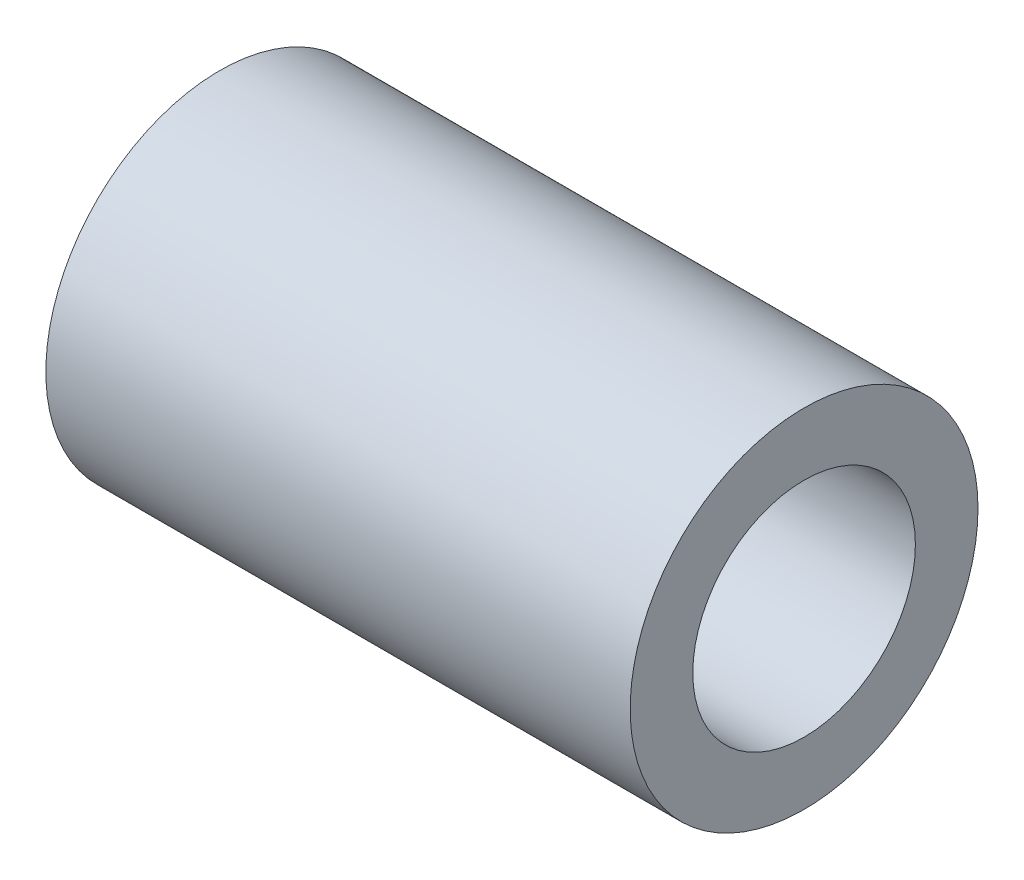
ISO-10303-21;
HEADER;
FILE_DESCRIPTION(('STEP AP214'),'2;1');
FILE_NAME('part.step','',(''),(''),'','','');
FILE_SCHEMA(('AUTOMOTIVE_DESIGN { 1 0 10303 214 1 1 1 1 }'));
ENDSEC;
DATA;
#1=APPLICATION_CONTEXT('core data for automotive mechanical design processes');
#2=APPLICATION_PROTOCOL_DEFINITION('international standard','automotive_design',2000,#1);
#3=PRODUCT_CONTEXT('',#1,'mechanical');
#4=PRODUCT('Part','Part','',(#3));
#5=PRODUCT_RELATED_PRODUCT_CATEGORY('part','',(#4));
#6=PRODUCT_DEFINITION_FORMATION('','',#4);
#7=PRODUCT_DEFINITION_CONTEXT('part definition',#1,'design');
#8=PRODUCT_DEFINITION('design','',#6,#7);
#9=PRODUCT_DEFINITION_SHAPE('','',#8);
#10=(LENGTH_UNIT() NAMED_UNIT(*) SI_UNIT(.MILLI.,.METRE.));
#11=(NAMED_UNIT(*) PLANE_ANGLE_UNIT() SI_UNIT($,.RADIAN.));
#12=(NAMED_UNIT(*) SI_UNIT($,.STERADIAN.) SOLID_ANGLE_UNIT());
#13=UNCERTAINTY_MEASURE_WITH_UNIT(LENGTH_MEASURE(1.E-05),#10,'distance_accuracy_value','');
#14=(GEOMETRIC_REPRESENTATION_CONTEXT(3) GLOBAL_UNCERTAINTY_ASSIGNED_CONTEXT((#13)) GLOBAL_UNIT_ASSIGNED_CONTEXT((#10,
#11,#12)) REPRESENTATION_CONTEXT('',''));
#15=CARTESIAN_POINT('',(0.,0.,0.));
#16=DIRECTION('',(0.,0.,1.));
#17=DIRECTION('',(1.,0.,0.));
#18=AXIS2_PLACEMENT_3D('',#15,#16,#17);
#19=CARTESIAN_POINT('',(8.4,0.,0.));
#20=DIRECTION('',(1.,0.,0.));
#21=DIRECTION('',(0.,0.,-1.));
#22=AXIS2_PLACEMENT_3D('',#19,#20,#21);
#23=PLANE('',#22);
#24=CARTESIAN_POINT('',(8.4,0.,0.));
#25=DIRECTION('',(1.,0.,0.));
#26=DIRECTION('',(0.,0.,-1.));
#27=AXIS2_PLACEMENT_3D('',#24,#25,#26);
#28=CIRCLE('',#27,2.5);
#29=CARTESIAN_POINT('',(8.4,0.,-2.5));
#30=VERTEX_POINT('',#29);
#31=EDGE_CURVE('E10',#30,#30,#28,.T.);
#32=ORIENTED_EDGE('',*,*,#31,.T.);
#33=EDGE_LOOP('',(#32));
#34=FACE_BOUND('',#33,.T.);
#35=CARTESIAN_POINT('',(8.4,0.,0.));
#36=DIRECTION('',(1.,0.,0.));
#37=DIRECTION('',(0.,0.,-1.));
#38=AXIS2_PLACEMENT_3D('',#35,#36,#37);
#39=CIRCLE('',#38,1.6);
#40=CARTESIAN_POINT('',(8.4,0.,-1.6));
#41=VERTEX_POINT('',#40);
#42=EDGE_CURVE('E50',#41,#41,#39,.T.);
#43=ORIENTED_EDGE('',*,*,#42,.F.);
#44=EDGE_LOOP('',(#43));
#45=FACE_BOUND('',#44,.T.);
#46=ADVANCED_FACE('F37',(#34,#45),#23,.T.);
#47=CARTESIAN_POINT('',(0.,0.,0.));
#48=DIRECTION('',(1.,0.,0.));
#49=DIRECTION('',(0.,0.,-1.));
#50=AXIS2_PLACEMENT_3D('',#47,#48,#49);
#51=PLANE('',#50);
#52=CARTESIAN_POINT('',(0.,0.,0.));
#53=DIRECTION('',(1.,0.,0.));
#54=DIRECTION('',(0.,0.,-1.));
#55=AXIS2_PLACEMENT_3D('',#52,#53,#54);
#56=CIRCLE('',#55,2.5);
#57=CARTESIAN_POINT('',(0.,0.,-2.5));
#58=VERTEX_POINT('',#57);
#59=EDGE_CURVE('E41',#58,#58,#56,.T.);
#60=ORIENTED_EDGE('',*,*,#59,.F.);
#61=EDGE_LOOP('',(#60));
#62=FACE_BOUND('',#61,.T.);
#63=CARTESIAN_POINT('',(0.,0.,0.));
#64=DIRECTION('',(1.,0.,0.));
#65=DIRECTION('',(0.,0.,-1.));
#66=AXIS2_PLACEMENT_3D('',#63,#64,#65);
#67=CIRCLE('',#66,1.6);
#68=CARTESIAN_POINT('',(0.,0.,-1.6));
#69=VERTEX_POINT('',#68);
#70=EDGE_CURVE('E52',#69,#69,#67,.T.);
#71=ORIENTED_EDGE('',*,*,#70,.T.);
#72=EDGE_LOOP('',(#71));
#73=FACE_BOUND('',#72,.T.);
#74=ADVANCED_FACE('F64',(#62,#73),#51,.F.);
#75=CARTESIAN_POINT('',(8.4,0.,0.));
#76=DIRECTION('',(-1.,0.,0.));
#77=DIRECTION('',(0.,0.,1.));
#78=AXIS2_PLACEMENT_3D('',#75,#76,#77);
#79=CYLINDRICAL_SURFACE('',#78,2.5);
#80=ORIENTED_EDGE('',*,*,#31,.F.);
#81=EDGE_LOOP('',(#80));
#82=FACE_BOUND('',#81,.T.);
#83=ORIENTED_EDGE('',*,*,#59,.T.);
#84=EDGE_LOOP('',(#83));
#85=FACE_BOUND('',#84,.T.);
#86=ADVANCED_FACE('F39',(#82,#85),#79,.T.);
#87=CARTESIAN_POINT('',(8.4,0.,0.));
#88=DIRECTION('',(-1.,0.,0.));
#89=DIRECTION('',(0.,0.,1.));
#90=AXIS2_PLACEMENT_3D('',#87,#88,#89);
#91=CYLINDRICAL_SURFACE('',#90,1.6);
#92=ORIENTED_EDGE('',*,*,#42,.T.);
#93=EDGE_LOOP('',(#92));
#94=FACE_BOUND('',#93,.T.);
#95=ORIENTED_EDGE('',*,*,#70,.F.);
#96=EDGE_LOOP('',(#95));
#97=FACE_BOUND('',#96,.T.);
#98=ADVANCED_FACE('F60',(#94,#97),#91,.F.);
#99=CLOSED_SHELL('',(#46,#74,#86,#98));
#100=MANIFOLD_SOLID_BREP('B2',#99);
#101=ADVANCED_BREP_SHAPE_REPRESENTATION('',(#18,#100),#14);
#102=SHAPE_DEFINITION_REPRESENTATION(#9,#101);
ENDSEC;
END-ISO-10303-21;
